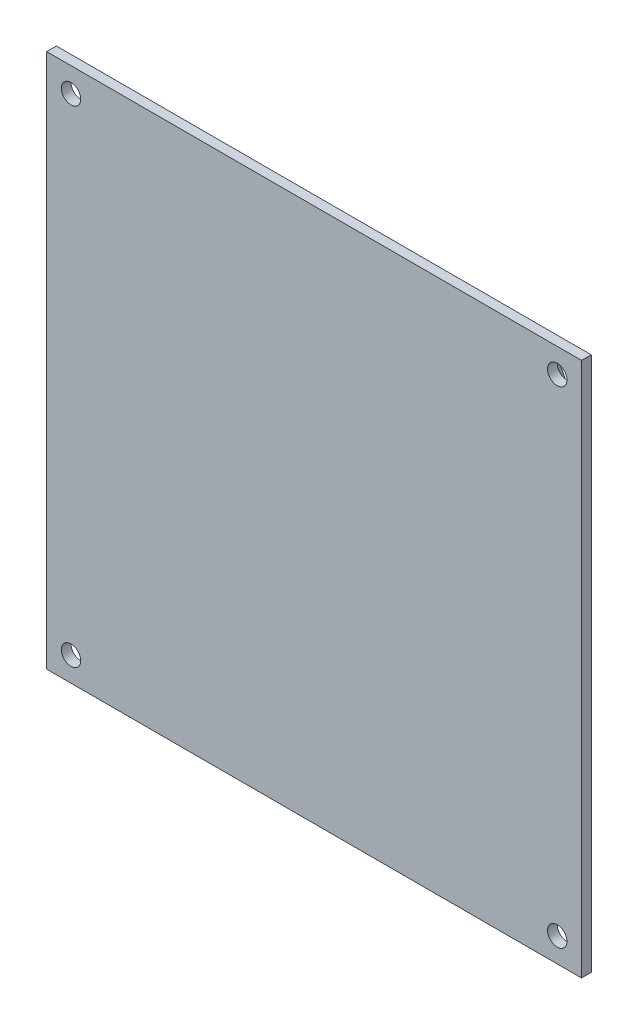
ISO-10303-21;
HEADER;
FILE_DESCRIPTION(('STEP AP214'),'2;1');
FILE_NAME('part.step','',(''),(''),'','','');
FILE_SCHEMA(('AUTOMOTIVE_DESIGN { 1 0 10303 214 1 1 1 1 }'));
ENDSEC;
DATA;
#1=APPLICATION_CONTEXT('core data for automotive mechanical design processes');
#2=APPLICATION_PROTOCOL_DEFINITION('international standard','automotive_design',2000,#1);
#3=PRODUCT_CONTEXT('',#1,'mechanical');
#4=PRODUCT('Part','Part','',(#3));
#5=PRODUCT_RELATED_PRODUCT_CATEGORY('part','',(#4));
#6=PRODUCT_DEFINITION_FORMATION('','',#4);
#7=PRODUCT_DEFINITION_CONTEXT('part definition',#1,'design');
#8=PRODUCT_DEFINITION('design','',#6,#7);
#9=PRODUCT_DEFINITION_SHAPE('','',#8);
#10=(LENGTH_UNIT() NAMED_UNIT(*) SI_UNIT(.MILLI.,.METRE.));
#11=(NAMED_UNIT(*) PLANE_ANGLE_UNIT() SI_UNIT($,.RADIAN.));
#12=(NAMED_UNIT(*) SI_UNIT($,.STERADIAN.) SOLID_ANGLE_UNIT());
#13=UNCERTAINTY_MEASURE_WITH_UNIT(LENGTH_MEASURE(1.E-05),#10,'distance_accuracy_value','');
#14=(GEOMETRIC_REPRESENTATION_CONTEXT(3) GLOBAL_UNCERTAINTY_ASSIGNED_CONTEXT((#13)) GLOBAL_UNIT_ASSIGNED_CONTEXT((#10,
#11,#12)) REPRESENTATION_CONTEXT('',''));
#15=CARTESIAN_POINT('',(0.,0.,0.));
#16=DIRECTION('',(0.,0.,1.));
#17=DIRECTION('',(1.,0.,0.));
#18=AXIS2_PLACEMENT_3D('',#15,#16,#17);
#19=CARTESIAN_POINT('',(0.,0.,0.));
#20=DIRECTION('',(0.,0.,1.));
#21=DIRECTION('',(1.,0.,0.));
#22=AXIS2_PLACEMENT_3D('',#19,#20,#21);
#23=PLANE('',#22);
#24=CARTESIAN_POINT('',(50.,50.,0.));
#25=DIRECTION('',(0.,0.,1.));
#26=DIRECTION('',(1.,0.,0.));
#27=AXIS2_PLACEMENT_3D('',#24,#25,#26);
#28=CIRCLE('',#27,2.);
#29=CARTESIAN_POINT('',(52.,50.,0.));
#30=VERTEX_POINT('',#29);
#31=EDGE_CURVE('E134',#30,#30,#28,.T.);
#32=ORIENTED_EDGE('',*,*,#31,.T.);
#33=EDGE_LOOP('',(#32));
#34=FACE_BOUND('',#33,.T.);
#35=CARTESIAN_POINT('',(50.,-50.,0.));
#36=DIRECTION('',(0.,0.,1.));
#37=DIRECTION('',(1.,0.,0.));
#38=AXIS2_PLACEMENT_3D('',#35,#36,#37);
#39=CIRCLE('',#38,2.);
#40=CARTESIAN_POINT('',(52.,-50.,0.));
#41=VERTEX_POINT('',#40);
#42=EDGE_CURVE('E138',#41,#41,#39,.T.);
#43=ORIENTED_EDGE('',*,*,#42,.T.);
#44=EDGE_LOOP('',(#43));
#45=FACE_BOUND('',#44,.T.);
#46=CARTESIAN_POINT('',(-50.,-50.,0.));
#47=DIRECTION('',(0.,0.,1.));
#48=DIRECTION('',(1.,0.,0.));
#49=AXIS2_PLACEMENT_3D('',#46,#47,#48);
#50=CIRCLE('',#49,2.);
#51=CARTESIAN_POINT('',(-48.,-50.,0.));
#52=VERTEX_POINT('',#51);
#53=EDGE_CURVE('E144',#52,#52,#50,.T.);
#54=ORIENTED_EDGE('',*,*,#53,.T.);
#55=EDGE_LOOP('',(#54));
#56=FACE_BOUND('',#55,.T.);
#57=CARTESIAN_POINT('',(-50.,50.,0.));
#58=DIRECTION('',(0.,0.,1.));
#59=DIRECTION('',(1.,0.,0.));
#60=AXIS2_PLACEMENT_3D('',#57,#58,#59);
#61=CIRCLE('',#60,2.);
#62=CARTESIAN_POINT('',(-48.,50.,0.));
#63=VERTEX_POINT('',#62);
#64=EDGE_CURVE('E150',#63,#63,#61,.T.);
#65=ORIENTED_EDGE('',*,*,#64,.T.);
#66=EDGE_LOOP('',(#65));
#67=FACE_BOUND('',#66,.T.);
#68=DIRECTION('',(0.,1.,0.));
#69=VECTOR('',#68,1.);
#70=CARTESIAN_POINT('',(55.,55.,0.));
#71=LINE('',#70,#69);
#72=CARTESIAN_POINT('',(55.,-55.,0.));
#73=VERTEX_POINT('',#72);
#74=CARTESIAN_POINT('',(55.,55.,0.));
#75=VERTEX_POINT('',#74);
#76=EDGE_CURVE('E156',#73,#75,#71,.T.);
#77=ORIENTED_EDGE('',*,*,#76,.F.);
#78=DIRECTION('',(1.,0.,0.));
#79=VECTOR('',#78,1.);
#80=CARTESIAN_POINT('',(-55.,-55.,0.));
#81=LINE('',#80,#79);
#82=CARTESIAN_POINT('',(-55.,-55.,0.));
#83=VERTEX_POINT('',#82);
#84=EDGE_CURVE('E163',#83,#73,#81,.T.);
#85=ORIENTED_EDGE('',*,*,#84,.F.);
#86=DIRECTION('',(0.,-1.,0.));
#87=VECTOR('',#86,1.);
#88=CARTESIAN_POINT('',(-55.,55.,0.));
#89=LINE('',#88,#87);
#90=CARTESIAN_POINT('',(-55.,55.,0.));
#91=VERTEX_POINT('',#90);
#92=EDGE_CURVE('E174',#91,#83,#89,.T.);
#93=ORIENTED_EDGE('',*,*,#92,.F.);
#94=DIRECTION('',(-1.,0.,0.));
#95=VECTOR('',#94,1.);
#96=CARTESIAN_POINT('',(-55.,55.,0.));
#97=LINE('',#96,#95);
#98=EDGE_CURVE('E172',#75,#91,#97,.T.);
#99=ORIENTED_EDGE('',*,*,#98,.F.);
#100=EDGE_LOOP('',(#77,#85,#93,#99));
#101=FACE_BOUND('',#100,.T.);
#102=DIRECTION('',(0.,1.,0.));
#103=VECTOR('',#102,1.);
#104=CARTESIAN_POINT('',(-5.,15.,0.));
#105=LINE('',#104,#103);
#106=CARTESIAN_POINT('',(-5.,-15.,0.));
#107=VERTEX_POINT('',#106);
#108=CARTESIAN_POINT('',(-5.,15.,0.));
#109=VERTEX_POINT('',#108);
#110=EDGE_CURVE('E105',#107,#109,#105,.T.);
#111=ORIENTED_EDGE('',*,*,#110,.F.);
#112=DIRECTION('',(-1.,0.,0.));
#113=VECTOR('',#112,1.);
#114=CARTESIAN_POINT('',(5.,-15.,0.));
#115=LINE('',#114,#113);
#116=CARTESIAN_POINT('',(5.,-15.,0.));
#117=VERTEX_POINT('',#116);
#118=EDGE_CURVE('E113',#117,#107,#115,.T.);
#119=ORIENTED_EDGE('',*,*,#118,.F.);
#120=DIRECTION('',(0.,-1.,0.));
#121=VECTOR('',#120,1.);
#122=CARTESIAN_POINT('',(5.,15.,0.));
#123=LINE('',#122,#121);
#124=CARTESIAN_POINT('',(5.,15.,0.));
#125=VERTEX_POINT('',#124);
#126=EDGE_CURVE('E124',#125,#117,#123,.T.);
#127=ORIENTED_EDGE('',*,*,#126,.F.);
#128=DIRECTION('',(1.,0.,0.));
#129=VECTOR('',#128,1.);
#130=CARTESIAN_POINT('',(5.,15.,0.));
#131=LINE('',#130,#129);
#132=EDGE_CURVE('E121',#109,#125,#131,.T.);
#133=ORIENTED_EDGE('',*,*,#132,.F.);
#134=EDGE_LOOP('',(#111,#119,#127,#133));
#135=FACE_BOUND('',#134,.T.);
#136=ADVANCED_FACE('F33',(#34,#45,#56,#67,#101,#135),#23,.F.);
#137=CARTESIAN_POINT('',(0.,0.,2.));
#138=DIRECTION('',(0.,0.,1.));
#139=DIRECTION('',(1.,0.,0.));
#140=AXIS2_PLACEMENT_3D('',#137,#138,#139);
#141=PLANE('',#140);
#142=CARTESIAN_POINT('',(50.,-50.,2.));
#143=DIRECTION('',(0.,0.,1.));
#144=DIRECTION('',(1.,0.,0.));
#145=AXIS2_PLACEMENT_3D('',#142,#143,#144);
#146=CIRCLE('',#145,2.);
#147=CARTESIAN_POINT('',(52.,-50.,2.));
#148=VERTEX_POINT('',#147);
#149=EDGE_CURVE('E141',#148,#148,#146,.T.);
#150=ORIENTED_EDGE('',*,*,#149,.F.);
#151=EDGE_LOOP('',(#150));
#152=FACE_BOUND('',#151,.T.);
#153=CARTESIAN_POINT('',(-50.,50.,2.));
#154=DIRECTION('',(0.,0.,1.));
#155=DIRECTION('',(1.,0.,0.));
#156=AXIS2_PLACEMENT_3D('',#153,#154,#155);
#157=CIRCLE('',#156,2.);
#158=CARTESIAN_POINT('',(-48.,50.,2.));
#159=VERTEX_POINT('',#158);
#160=EDGE_CURVE('E153',#159,#159,#157,.T.);
#161=ORIENTED_EDGE('',*,*,#160,.F.);
#162=EDGE_LOOP('',(#161));
#163=FACE_BOUND('',#162,.T.);
#164=DIRECTION('',(0.,1.,0.));
#165=VECTOR('',#164,1.);
#166=CARTESIAN_POINT('',(55.,55.,2.));
#167=LINE('',#166,#165);
#168=CARTESIAN_POINT('',(55.,-55.,2.));
#169=VERTEX_POINT('',#168);
#170=CARTESIAN_POINT('',(55.,55.,2.));
#171=VERTEX_POINT('',#170);
#172=EDGE_CURVE('E159',#169,#171,#167,.T.);
#173=ORIENTED_EDGE('',*,*,#172,.T.);
#174=DIRECTION('',(-1.,0.,0.));
#175=VECTOR('',#174,1.);
#176=CARTESIAN_POINT('',(-55.,55.,2.));
#177=LINE('',#176,#175);
#178=CARTESIAN_POINT('',(-55.,55.,2.));
#179=VERTEX_POINT('',#178);
#180=EDGE_CURVE('E162',#171,#179,#177,.T.);
#181=ORIENTED_EDGE('',*,*,#180,.T.);
#182=DIRECTION('',(0.,-1.,0.));
#183=VECTOR('',#182,1.);
#184=CARTESIAN_POINT('',(-55.,55.,2.));
#185=LINE('',#184,#183);
#186=CARTESIAN_POINT('',(-55.,-55.,2.));
#187=VERTEX_POINT('',#186);
#188=EDGE_CURVE('E165',#179,#187,#185,.T.);
#189=ORIENTED_EDGE('',*,*,#188,.T.);
#190=DIRECTION('',(1.,0.,0.));
#191=VECTOR('',#190,1.);
#192=CARTESIAN_POINT('',(-55.,-55.,2.));
#193=LINE('',#192,#191);
#194=EDGE_CURVE('E167',#187,#169,#193,.T.);
#195=ORIENTED_EDGE('',*,*,#194,.T.);
#196=EDGE_LOOP('',(#173,#181,#189,#195));
#197=FACE_BOUND('',#196,.T.);
#198=CARTESIAN_POINT('',(-50.,-50.,2.));
#199=DIRECTION('',(0.,0.,1.));
#200=DIRECTION('',(1.,0.,0.));
#201=AXIS2_PLACEMENT_3D('',#198,#199,#200);
#202=CIRCLE('',#201,2.);
#203=CARTESIAN_POINT('',(-48.,-50.,2.));
#204=VERTEX_POINT('',#203);
#205=EDGE_CURVE('E147',#204,#204,#202,.T.);
#206=ORIENTED_EDGE('',*,*,#205,.F.);
#207=EDGE_LOOP('',(#206));
#208=FACE_BOUND('',#207,.T.);
#209=CARTESIAN_POINT('',(50.,50.,2.));
#210=DIRECTION('',(0.,0.,1.));
#211=DIRECTION('',(1.,0.,0.));
#212=AXIS2_PLACEMENT_3D('',#209,#210,#211);
#213=CIRCLE('',#212,2.);
#214=CARTESIAN_POINT('',(52.,50.,2.));
#215=VERTEX_POINT('',#214);
#216=EDGE_CURVE('E135',#215,#215,#213,.T.);
#217=ORIENTED_EDGE('',*,*,#216,.F.);
#218=EDGE_LOOP('',(#217));
#219=FACE_BOUND('',#218,.T.);
#220=ADVANCED_FACE('F210',(#152,#163,#197,#208,#219),#141,.T.);
#221=CARTESIAN_POINT('',(55.,55.,2.));
#222=DIRECTION('',(-1.,0.,0.));
#223=DIRECTION('',(0.,-1.,0.));
#224=AXIS2_PLACEMENT_3D('',#221,#222,#223);
#225=PLANE('',#224);
#226=ORIENTED_EDGE('',*,*,#76,.T.);
#227=DIRECTION('',(0.,0.,-1.));
#228=VECTOR('',#227,1.);
#229=CARTESIAN_POINT('',(55.,55.,2.));
#230=LINE('',#229,#228);
#231=EDGE_CURVE('E185',#171,#75,#230,.T.);
#232=ORIENTED_EDGE('',*,*,#231,.F.);
#233=ORIENTED_EDGE('',*,*,#172,.F.);
#234=DIRECTION('',(0.,0.,-1.));
#235=VECTOR('',#234,1.);
#236=CARTESIAN_POINT('',(55.,-55.,2.));
#237=LINE('',#236,#235);
#238=EDGE_CURVE('E169',#169,#73,#237,.T.);
#239=ORIENTED_EDGE('',*,*,#238,.T.);
#240=EDGE_LOOP('',(#226,#232,#233,#239));
#241=FACE_BOUND('',#240,.T.);
#242=ADVANCED_FACE('F216',(#241),#225,.F.);
#243=CARTESIAN_POINT('',(-55.,55.,2.));
#244=DIRECTION('',(0.,-1.,0.));
#245=DIRECTION('',(0.,0.,-1.));
#246=AXIS2_PLACEMENT_3D('',#243,#244,#245);
#247=PLANE('',#246);
#248=ORIENTED_EDGE('',*,*,#98,.T.);
#249=DIRECTION('',(0.,0.,-1.));
#250=VECTOR('',#249,1.);
#251=CARTESIAN_POINT('',(-55.,55.,2.));
#252=LINE('',#251,#250);
#253=EDGE_CURVE('E182',#179,#91,#252,.T.);
#254=ORIENTED_EDGE('',*,*,#253,.F.);
#255=ORIENTED_EDGE('',*,*,#180,.F.);
#256=ORIENTED_EDGE('',*,*,#231,.T.);
#257=EDGE_LOOP('',(#248,#254,#255,#256));
#258=FACE_BOUND('',#257,.T.);
#259=ADVANCED_FACE('F230',(#258),#247,.F.);
#260=CARTESIAN_POINT('',(-55.,55.,2.));
#261=DIRECTION('',(1.,0.,0.));
#262=DIRECTION('',(0.,1.,0.));
#263=AXIS2_PLACEMENT_3D('',#260,#261,#262);
#264=PLANE('',#263);
#265=ORIENTED_EDGE('',*,*,#92,.T.);
#266=DIRECTION('',(0.,0.,-1.));
#267=VECTOR('',#266,1.);
#268=CARTESIAN_POINT('',(-55.,-55.,2.));
#269=LINE('',#268,#267);
#270=EDGE_CURVE('E179',#187,#83,#269,.T.);
#271=ORIENTED_EDGE('',*,*,#270,.F.);
#272=ORIENTED_EDGE('',*,*,#188,.F.);
#273=ORIENTED_EDGE('',*,*,#253,.T.);
#274=EDGE_LOOP('',(#265,#271,#272,#273));
#275=FACE_BOUND('',#274,.T.);
#276=ADVANCED_FACE('F226',(#275),#264,.F.);
#277=CARTESIAN_POINT('',(-55.,-55.,2.));
#278=DIRECTION('',(0.,1.,0.));
#279=DIRECTION('',(0.,0.,1.));
#280=AXIS2_PLACEMENT_3D('',#277,#278,#279);
#281=PLANE('',#280);
#282=ORIENTED_EDGE('',*,*,#84,.T.);
#283=ORIENTED_EDGE('',*,*,#238,.F.);
#284=ORIENTED_EDGE('',*,*,#194,.F.);
#285=ORIENTED_EDGE('',*,*,#270,.T.);
#286=EDGE_LOOP('',(#282,#283,#284,#285));
#287=FACE_BOUND('',#286,.T.);
#288=ADVANCED_FACE('F222',(#287),#281,.F.);
#289=CARTESIAN_POINT('',(-50.,50.,2.));
#290=DIRECTION('',(0.,0.,-1.));
#291=DIRECTION('',(-1.,0.,0.));
#292=AXIS2_PLACEMENT_3D('',#289,#290,#291);
#293=CYLINDRICAL_SURFACE('',#292,2.);
#294=ORIENTED_EDGE('',*,*,#160,.T.);
#295=EDGE_LOOP('',(#294));
#296=FACE_BOUND('',#295,.T.);
#297=ORIENTED_EDGE('',*,*,#64,.F.);
#298=EDGE_LOOP('',(#297));
#299=FACE_BOUND('',#298,.T.);
#300=ADVANCED_FACE('F225',(#296,#299),#293,.F.);
#301=CARTESIAN_POINT('',(-50.,-50.,2.));
#302=DIRECTION('',(0.,0.,-1.));
#303=DIRECTION('',(-1.,0.,0.));
#304=AXIS2_PLACEMENT_3D('',#301,#302,#303);
#305=CYLINDRICAL_SURFACE('',#304,2.);
#306=ORIENTED_EDGE('',*,*,#205,.T.);
#307=EDGE_LOOP('',(#306));
#308=FACE_BOUND('',#307,.T.);
#309=ORIENTED_EDGE('',*,*,#53,.F.);
#310=EDGE_LOOP('',(#309));
#311=FACE_BOUND('',#310,.T.);
#312=ADVANCED_FACE('F266',(#308,#311),#305,.F.);
#313=CARTESIAN_POINT('',(50.,-50.,2.));
#314=DIRECTION('',(0.,0.,-1.));
#315=DIRECTION('',(-1.,0.,0.));
#316=AXIS2_PLACEMENT_3D('',#313,#314,#315);
#317=CYLINDRICAL_SURFACE('',#316,2.);
#318=ORIENTED_EDGE('',*,*,#149,.T.);
#319=EDGE_LOOP('',(#318));
#320=FACE_BOUND('',#319,.T.);
#321=ORIENTED_EDGE('',*,*,#42,.F.);
#322=EDGE_LOOP('',(#321));
#323=FACE_BOUND('',#322,.T.);
#324=ADVANCED_FACE('F258',(#320,#323),#317,.F.);
#325=CARTESIAN_POINT('',(50.,50.,2.));
#326=DIRECTION('',(0.,0.,-1.));
#327=DIRECTION('',(-1.,0.,0.));
#328=AXIS2_PLACEMENT_3D('',#325,#326,#327);
#329=CYLINDRICAL_SURFACE('',#328,2.);
#330=ORIENTED_EDGE('',*,*,#216,.T.);
#331=EDGE_LOOP('',(#330));
#332=FACE_BOUND('',#331,.T.);
#333=ORIENTED_EDGE('',*,*,#31,.F.);
#334=EDGE_LOOP('',(#333));
#335=FACE_BOUND('',#334,.T.);
#336=ADVANCED_FACE('F255',(#332,#335),#329,.F.);
#337=CARTESIAN_POINT('',(-5.,15.,-45.));
#338=DIRECTION('',(1.,0.,0.));
#339=DIRECTION('',(0.,1.,0.));
#340=AXIS2_PLACEMENT_3D('',#337,#338,#339);
#341=PLANE('',#340);
#342=CARTESIAN_POINT('',(-5.,0.,-30.));
#343=DIRECTION('',(1.,0.,0.));
#344=DIRECTION('',(0.,1.,0.));
#345=AXIS2_PLACEMENT_3D('',#342,#343,#344);
#346=CIRCLE('',#345,15.);
#347=CARTESIAN_POINT('',(-5.,15.,-30.));
#348=VERTEX_POINT('',#347);
#349=CARTESIAN_POINT('',(-5.,0.,-45.));
#350=VERTEX_POINT('',#349);
#351=EDGE_CURVE('E188',#348,#350,#346,.F.);
#352=ORIENTED_EDGE('',*,*,#351,.T.);
#353=CARTESIAN_POINT('',(-5.,0.,-30.));
#354=DIRECTION('',(1.,0.,0.));
#355=DIRECTION('',(0.,1.,0.));
#356=AXIS2_PLACEMENT_3D('',#353,#354,#355);
#357=CIRCLE('',#356,15.);
#358=CARTESIAN_POINT('',(-5.,-15.,-30.));
#359=VERTEX_POINT('',#358);
#360=EDGE_CURVE('E107',#350,#359,#357,.F.);
#361=ORIENTED_EDGE('',*,*,#360,.T.);
#362=DIRECTION('',(0.,0.,1.));
#363=VECTOR('',#362,1.);
#364=CARTESIAN_POINT('',(-5.,-15.,-45.));
#365=LINE('',#364,#363);
#366=EDGE_CURVE('E101',#359,#107,#365,.T.);
#367=ORIENTED_EDGE('',*,*,#366,.T.);
#368=ORIENTED_EDGE('',*,*,#110,.T.);
#369=DIRECTION('',(0.,0.,1.));
#370=VECTOR('',#369,1.);
#371=CARTESIAN_POINT('',(-5.,15.,-45.));
#372=LINE('',#371,#370);
#373=EDGE_CURVE('E132',#348,#109,#372,.T.);
#374=ORIENTED_EDGE('',*,*,#373,.F.);
#375=EDGE_LOOP('',(#352,#361,#367,#368,#374));
#376=FACE_BOUND('',#375,.T.);
#377=ADVANCED_FACE('F103',(#376),#341,.F.);
#378=CARTESIAN_POINT('',(5.,15.,-45.));
#379=DIRECTION('',(0.,-1.,0.));
#380=DIRECTION('',(0.,0.,-1.));
#381=AXIS2_PLACEMENT_3D('',#378,#379,#380);
#382=PLANE('',#381);
#383=DIRECTION('',(0.,0.,1.));
#384=VECTOR('',#383,1.);
#385=CARTESIAN_POINT('',(5.,15.,-45.));
#386=LINE('',#385,#384);
#387=CARTESIAN_POINT('',(5.,15.,-30.));
#388=VERTEX_POINT('',#387);
#389=EDGE_CURVE('E130',#388,#125,#386,.T.);
#390=ORIENTED_EDGE('',*,*,#389,.F.);
#391=DIRECTION('',(1.,0.,0.));
#392=VECTOR('',#391,1.);
#393=CARTESIAN_POINT('',(-5.,15.,-30.));
#394=LINE('',#393,#392);
#395=EDGE_CURVE('E11',#388,#348,#394,.F.);
#396=ORIENTED_EDGE('',*,*,#395,.T.);
#397=ORIENTED_EDGE('',*,*,#373,.T.);
#398=ORIENTED_EDGE('',*,*,#132,.T.);
#399=EDGE_LOOP('',(#390,#396,#397,#398));
#400=FACE_BOUND('',#399,.T.);
#401=ADVANCED_FACE('F197',(#400),#382,.F.);
#402=CARTESIAN_POINT('',(5.,15.,-45.));
#403=DIRECTION('',(-1.,0.,0.));
#404=DIRECTION('',(0.,-1.,0.));
#405=AXIS2_PLACEMENT_3D('',#402,#403,#404);
#406=PLANE('',#405);
#407=DIRECTION('',(0.,0.,1.));
#408=VECTOR('',#407,1.);
#409=CARTESIAN_POINT('',(5.,-15.,-45.));
#410=LINE('',#409,#408);
#411=CARTESIAN_POINT('',(5.,-15.,-30.));
#412=VERTEX_POINT('',#411);
#413=EDGE_CURVE('E112',#412,#117,#410,.T.);
#414=ORIENTED_EDGE('',*,*,#413,.F.);
#415=CARTESIAN_POINT('',(5.,0.,-30.));
#416=DIRECTION('',(-1.,0.,0.));
#417=DIRECTION('',(0.,-1.,0.));
#418=AXIS2_PLACEMENT_3D('',#415,#416,#417);
#419=CIRCLE('',#418,15.);
#420=CARTESIAN_POINT('',(5.,0.,-45.));
#421=VERTEX_POINT('',#420);
#422=EDGE_CURVE('E42',#412,#421,#419,.F.);
#423=ORIENTED_EDGE('',*,*,#422,.T.);
#424=CARTESIAN_POINT('',(5.,0.,-30.));
#425=DIRECTION('',(-1.,0.,0.));
#426=DIRECTION('',(0.,-1.,0.));
#427=AXIS2_PLACEMENT_3D('',#424,#425,#426);
#428=CIRCLE('',#427,15.);
#429=EDGE_CURVE('E49',#421,#388,#428,.F.);
#430=ORIENTED_EDGE('',*,*,#429,.T.);
#431=ORIENTED_EDGE('',*,*,#389,.T.);
#432=ORIENTED_EDGE('',*,*,#126,.T.);
#433=EDGE_LOOP('',(#414,#423,#430,#431,#432));
#434=FACE_BOUND('',#433,.T.);
#435=ADVANCED_FACE('F195',(#434),#406,.F.);
#436=CARTESIAN_POINT('',(5.,-15.,-45.));
#437=DIRECTION('',(0.,1.,0.));
#438=DIRECTION('',(0.,0.,1.));
#439=AXIS2_PLACEMENT_3D('',#436,#437,#438);
#440=PLANE('',#439);
#441=ORIENTED_EDGE('',*,*,#366,.F.);
#442=DIRECTION('',(-1.,0.,0.));
#443=VECTOR('',#442,1.);
#444=CARTESIAN_POINT('',(5.,-15.,-30.));
#445=LINE('',#444,#443);
#446=EDGE_CURVE('E191',#359,#412,#445,.F.);
#447=ORIENTED_EDGE('',*,*,#446,.T.);
#448=ORIENTED_EDGE('',*,*,#413,.T.);
#449=ORIENTED_EDGE('',*,*,#118,.T.);
#450=EDGE_LOOP('',(#441,#447,#448,#449));
#451=FACE_BOUND('',#450,.T.);
#452=ADVANCED_FACE('F123',(#451),#440,.F.);
#453=CARTESIAN_POINT('',(0.,0.,-30.));
#454=DIRECTION('',(-1.,0.,0.));
#455=DIRECTION('',(0.,0.,1.));
#456=AXIS2_PLACEMENT_3D('',#453,#454,#455);
#457=CYLINDRICAL_SURFACE('',#456,15.);
#458=ORIENTED_EDGE('',*,*,#395,.F.);
#459=ORIENTED_EDGE('',*,*,#429,.F.);
#460=DIRECTION('',(1.,0.,0.));
#461=VECTOR('',#460,1.);
#462=CARTESIAN_POINT('',(5.,0.,-45.));
#463=LINE('',#462,#461);
#464=EDGE_CURVE('E37',#350,#421,#463,.T.);
#465=ORIENTED_EDGE('',*,*,#464,.F.);
#466=ORIENTED_EDGE('',*,*,#351,.F.);
#467=EDGE_LOOP('',(#458,#459,#465,#466));
#468=FACE_BOUND('',#467,.T.);
#469=ADVANCED_FACE('F35',(#468),#457,.T.);
#470=CARTESIAN_POINT('',(0.,0.,-30.));
#471=DIRECTION('',(1.,0.,0.));
#472=DIRECTION('',(0.,0.,-1.));
#473=AXIS2_PLACEMENT_3D('',#470,#471,#472);
#474=CYLINDRICAL_SURFACE('',#473,15.);
#475=ORIENTED_EDGE('',*,*,#422,.F.);
#476=ORIENTED_EDGE('',*,*,#446,.F.);
#477=ORIENTED_EDGE('',*,*,#360,.F.);
#478=ORIENTED_EDGE('',*,*,#464,.T.);
#479=EDGE_LOOP('',(#475,#476,#477,#478));
#480=FACE_BOUND('',#479,.T.);
#481=ADVANCED_FACE('F203',(#480),#474,.T.);
#482=CLOSED_SHELL('',(#136,#220,#242,#259,#276,#288,#300,#312,#324,#336,#377,#401,#435,#452,
#469,#481));
#483=MANIFOLD_SOLID_BREP('B2',#482);
#484=ADVANCED_BREP_SHAPE_REPRESENTATION('',(#18,#483),#14);
#485=SHAPE_DEFINITION_REPRESENTATION(#9,#484);
ENDSEC;
END-ISO-10303-21;
